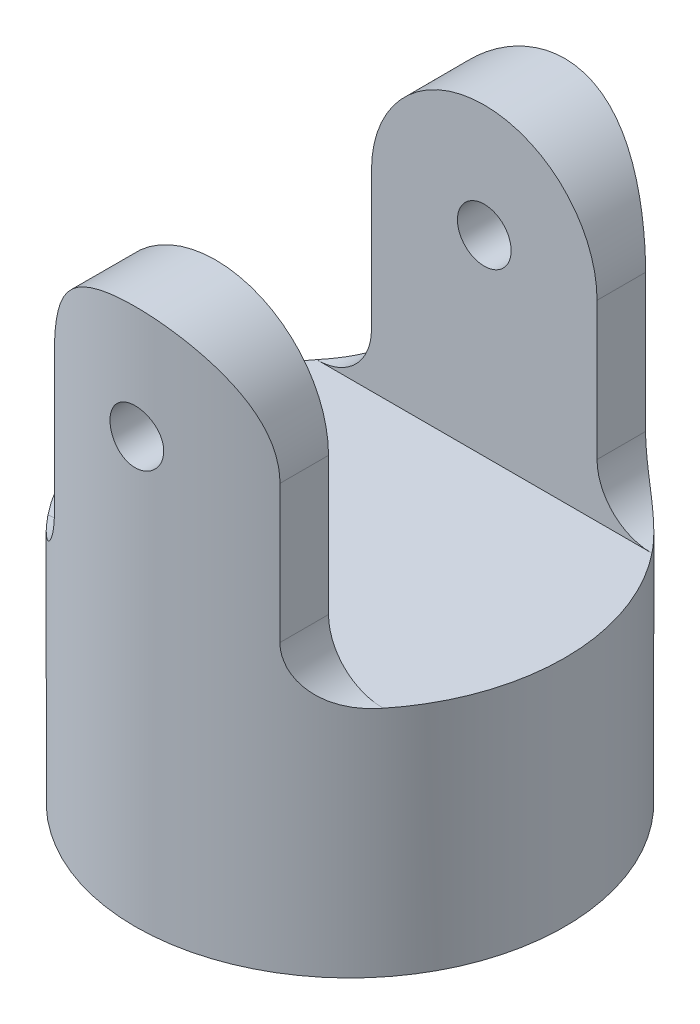
ISO-10303-21;
HEADER;
FILE_DESCRIPTION(('STEP AP214'),'2;1');
FILE_NAME('part.step','',(''),(''),'','','');
FILE_SCHEMA(('AUTOMOTIVE_DESIGN { 1 0 10303 214 1 1 1 1 }'));
ENDSEC;
DATA;
#1=APPLICATION_CONTEXT('core data for automotive mechanical design processes');
#2=APPLICATION_PROTOCOL_DEFINITION('international standard','automotive_design',2000,#1);
#3=PRODUCT_CONTEXT('',#1,'mechanical');
#4=PRODUCT('Part','Part','',(#3));
#5=PRODUCT_RELATED_PRODUCT_CATEGORY('part','',(#4));
#6=PRODUCT_DEFINITION_FORMATION('','',#4);
#7=PRODUCT_DEFINITION_CONTEXT('part definition',#1,'design');
#8=PRODUCT_DEFINITION('design','',#6,#7);
#9=PRODUCT_DEFINITION_SHAPE('','',#8);
#10=(LENGTH_UNIT() NAMED_UNIT(*) SI_UNIT(.MILLI.,.METRE.));
#11=(NAMED_UNIT(*) PLANE_ANGLE_UNIT() SI_UNIT($,.RADIAN.));
#12=(NAMED_UNIT(*) SI_UNIT($,.STERADIAN.) SOLID_ANGLE_UNIT());
#13=UNCERTAINTY_MEASURE_WITH_UNIT(LENGTH_MEASURE(1.E-05),#10,'distance_accuracy_value','');
#14=(GEOMETRIC_REPRESENTATION_CONTEXT(3) GLOBAL_UNCERTAINTY_ASSIGNED_CONTEXT((#13)) GLOBAL_UNIT_ASSIGNED_CONTEXT((#10,
#11,#12)) REPRESENTATION_CONTEXT('',''));
#15=CARTESIAN_POINT('',(0.,0.,0.));
#16=DIRECTION('',(0.,0.,1.));
#17=DIRECTION('',(1.,0.,0.));
#18=AXIS2_PLACEMENT_3D('',#15,#16,#17);
#19=CARTESIAN_POINT('',(0.,15.,0.));
#20=DIRECTION('',(0.,-1.,0.));
#21=DIRECTION('',(0.,0.,-1.));
#22=AXIS2_PLACEMENT_3D('',#19,#20,#21);
#23=CYLINDRICAL_SURFACE('',#22,6.);
#24=CARTESIAN_POINT('',(0.,12.6,-6.));
#25=CARTESIAN_POINT('',(-0.0419523286667284,12.5999982177193,-5.99999941468929));
#26=CARTESIAN_POINT('',(-0.083930872290824,12.5964681362492,-5.99955535366471));
#27=CARTESIAN_POINT('',(-0.166719840626926,12.5824416736288,-5.99782662033408));
#28=CARTESIAN_POINT('',(-0.207528999187123,12.571938018623,-5.99654107032429));
#29=CARTESIAN_POINT('',(-0.286768672443916,12.5442787068258,-5.99327418313322));
#30=CARTESIAN_POINT('',(-0.325200768043841,12.527127527457,-5.99129331436663));
#31=CARTESIAN_POINT('',(-0.398633842467911,12.4866698148091,-5.98685610263429));
#32=CARTESIAN_POINT('',(-0.433635408466911,12.4633643374408,-5.98439984125235));
#33=CARTESIAN_POINT('',(-0.499413845079395,12.4111224150481,-5.97927096391898));
#34=CARTESIAN_POINT('',(-0.530169109481138,12.3821588611961,-5.97659734407725));
#35=CARTESIAN_POINT('',(-0.586395838067248,12.319481152939,-5.97134317802925));
#36=CARTESIAN_POINT('',(-0.611867032917675,12.285766756526,-5.96876263657281));
#37=CARTESIAN_POINT('',(-0.656883048385182,12.2144040067303,-5.96397691685876));
#38=CARTESIAN_POINT('',(-0.676407628782322,12.1767427915296,-5.96177303153373));
#39=CARTESIAN_POINT('',(-0.708846922972535,12.0986438844158,-5.95800338537305));
#40=CARTESIAN_POINT('',(-0.721761887419565,12.0582062978559,-5.95643760033941));
#41=CARTESIAN_POINT('',(-0.740549694007429,11.975926741324,-5.95413101881084));
#42=CARTESIAN_POINT('',(-0.746459014419511,11.9340932226887,-5.95338595031023));
#43=CARTESIAN_POINT('',(-0.751180664867169,11.8500221209584,-5.95279208442838));
#44=CARTESIAN_POINT('',(-0.749993280300725,11.8077845541806,-5.95294325100452));
#45=CARTESIAN_POINT('',(-0.740585170934371,11.7243585518254,-5.95412086610926));
#46=CARTESIAN_POINT('',(-0.732404628895409,11.6831655041399,-5.95514231388099));
#47=CARTESIAN_POINT('',(-0.709305114954616,11.6027414936343,-5.95793759927289));
#48=CARTESIAN_POINT('',(-0.694386006525571,11.5635105705858,-5.95971145213717));
#49=CARTESIAN_POINT('',(-0.658189667973496,11.4879996002935,-5.96381734759395));
#50=CARTESIAN_POINT('',(-0.636894976112292,11.4517280099253,-5.96615091963433));
#51=CARTESIAN_POINT('',(-0.588564440837076,11.383257991676,-5.97111213429179));
#52=CARTESIAN_POINT('',(-0.561528334824234,11.3510597502079,-5.97373979035699));
#53=CARTESIAN_POINT('',(-0.502259733226134,11.2914171867832,-5.97901532967128));
#54=CARTESIAN_POINT('',(-0.469992602352004,11.2640072724702,-5.98166322716067));
#55=CARTESIAN_POINT('',(-0.401297150734177,11.2149873359908,-5.98666389766756));
#56=CARTESIAN_POINT('',(-0.364868820395475,11.1933773271984,-5.98901667000452));
#57=CARTESIAN_POINT('',(-0.288858501409044,11.1565706038608,-5.99316345665574));
#58=CARTESIAN_POINT('',(-0.249275458601315,11.1413760438356,-5.99495728320461));
#59=CARTESIAN_POINT('',(-0.168092382129317,11.117858851943,-5.99778235734018));
#60=CARTESIAN_POINT('',(-0.1264924429892,11.1095358983589,-5.99881364062761));
#61=CARTESIAN_POINT('',(-0.0427539491740493,11.1000427727218,-5.99999278923228));
#62=CARTESIAN_POINT('',(-0.000620847059582189,11.0988252022908,-6.00014650842791));
#63=CARTESIAN_POINT('',(0.083248810949249,11.1034523202168,-5.99956901401629));
#64=CARTESIAN_POINT('',(0.124985375269412,11.1092968581755,-5.99883781925464));
#65=CARTESIAN_POINT('',(0.206737352316457,11.1278429126323,-5.99657630627008));
#66=CARTESIAN_POINT('',(0.246757971127412,11.1405218290208,-5.99504862244161));
#67=CARTESIAN_POINT('',(0.324104896457522,11.1723532355739,-5.99136516930059));
#68=CARTESIAN_POINT('',(0.361431111439595,11.1915059455474,-5.98920937866187));
#69=CARTESIAN_POINT('',(0.432541356206229,11.2358559412522,-5.98449546873034));
#70=CARTESIAN_POINT('',(0.466306127983146,11.2610838869417,-5.98193533212753));
#71=CARTESIAN_POINT('',(0.529139096887896,11.3168248492603,-5.97670542697697));
#72=CARTESIAN_POINT('',(0.558207107501058,11.3473380756753,-5.9740356540807));
#73=CARTESIAN_POINT('',(0.610989587645405,11.4129922250271,-5.96886931638775));
#74=CARTESIAN_POINT('',(0.63467263817038,11.4481585038931,-5.96637382416398));
#75=CARTESIAN_POINT('',(0.675795866833052,11.5219974734564,-5.96185623311145));
#76=CARTESIAN_POINT('',(0.693236170118511,11.560670093843,-5.95983412479308));
#77=CARTESIAN_POINT('',(0.721327973659963,11.6403225957443,-5.95649955117899));
#78=CARTESIAN_POINT('',(0.731997188237133,11.6812961490144,-5.95518523555437));
#79=CARTESIAN_POINT('',(0.746300998160354,11.7644707451342,-5.95340974772236));
#80=CARTESIAN_POINT('',(0.749935920760729,11.8066717307877,-5.95294853582633));
#81=CARTESIAN_POINT('',(0.750061960825451,11.8907906787614,-5.95293263094737));
#82=CARTESIAN_POINT('',(0.746602439309782,11.9327085744996,-5.95337167425586));
#83=CARTESIAN_POINT('',(0.732742321454798,12.0153621388035,-5.9550933436116));
#84=CARTESIAN_POINT('',(0.722341724371731,12.0560978072426,-5.95637596974924));
#85=CARTESIAN_POINT('',(0.694910122106897,12.1352240870299,-5.95963834732365));
#86=CARTESIAN_POINT('',(0.67788149429128,12.1736155335065,-5.96161784877835));
#87=CARTESIAN_POINT('',(0.637682070645093,12.2470039962145,-5.96605134973446));
#88=CARTESIAN_POINT('',(0.614511197852877,12.2820009699059,-5.96850535518124));
#89=CARTESIAN_POINT('',(0.562501899379751,12.3478593676021,-5.9736318142567));
#90=CARTESIAN_POINT('',(0.533626687732487,12.3786916382865,-5.9763056162521));
#91=CARTESIAN_POINT('',(0.471105068090514,12.4350920475504,-5.9815584947787));
#92=CARTESIAN_POINT('',(0.437457536742469,12.4606589432323,-5.98413754882677));
#93=CARTESIAN_POINT('',(0.366199686256262,12.5058856071316,-5.98892116976024));
#94=CARTESIAN_POINT('',(0.32857478387885,12.5255225417698,-5.9911242752349));
#95=CARTESIAN_POINT('',(0.250554870690384,12.5581713728749,-5.99489294723018));
#96=CARTESIAN_POINT('',(0.210162924261071,12.571190467906,-5.99645920610873));
#97=CARTESIAN_POINT('',(0.141301731590377,12.5871178014514,-5.99840016098324));
#98=CARTESIAN_POINT('',(0.113266699055076,12.5919416825946,-5.99899717768636));
#99=CARTESIAN_POINT('',(0.0568251189637304,12.598383373708,-5.99979729398757));
#100=CARTESIAN_POINT('',(0.0284185741488081,12.6000012073198,-6.00000039649041));
#101=CARTESIAN_POINT('',(0.,12.6,-6.));
#102=B_SPLINE_CURVE_WITH_KNOTS('',3,(#24,#25,#26,#27,#28,#29,#30,#31,#32,#33,#34,#35,#36,#37,
#38,#39,#40,#41,#42,#43,#44,#45,#46,#47,#48,#49,#50,#51,#52,#53,#54,#55,#56,#57,#58,#59,#60,#61,
#62,#63,#64,#65,#66,#67,#68,#69,#70,#71,#72,#73,#74,#75,#76,#77,#78,#79,#80,#81,#82,#83,#84,#85,
#86,#87,#88,#89,#90,#91,#92,#93,#94,#95,#96,#97,#98,#99,#100,#101),.UNSPECIFIED.,.T.,.F.,(4,2,2,
2,2,2,2,2,2,2,2,2,2,2,2,2,2,2,2,2,2,2,2,2,2,2,2,2,2,2,2,2,2,2,2,2,2,2,4),(0.,0.125753181832874,
0.251637738283028,0.377437652454531,0.503215996773219,0.62961243960553,0.756015323400032,
0.882843750956608,1.00966736849042,1.13582767585896,1.26198290965399,1.38741808932508,
1.51285581049872,1.6386402788566,1.76443050154092,1.89109043440925,2.01775065933934,
2.14445338719482,2.27115018271134,2.39700083817576,2.52284881350579,2.64828316168019,
2.77372176923684,2.89980720878527,3.02589765412527,3.15270591452272,3.27951163266462,
3.40598422284278,3.53245092903187,3.65804070360665,3.78363049163865,3.90917527411946,
4.03472162973679,4.16110571307549,4.28751959541004,4.41441420911056,4.5411704960521,
4.62635652956289,4.71154193490131),.UNSPECIFIED.);
#103=CARTESIAN_POINT('',(0.,12.6,-6.));
#104=VERTEX_POINT('',#103);
#105=EDGE_CURVE('E408',#104,#104,#102,.T.);
#106=ORIENTED_EDGE('',*,*,#105,.T.);
#107=EDGE_LOOP('',(#106));
#108=FACE_BOUND('',#107,.T.);
#109=CARTESIAN_POINT('',(0.75,11.85,5.95294044989533));
#110=CARTESIAN_POINT('',(0.749998216450185,11.8080491148625,5.95294105251399));
#111=CARTESIAN_POINT('',(0.746468369706386,11.7660720105286,5.95338868535683));
#112=CARTESIAN_POINT('',(0.732442924116402,11.6832860323786,5.95513017293991));
#113=CARTESIAN_POINT('',(0.721940046327388,11.6424784258509,5.95642491192888));
#114=CARTESIAN_POINT('',(0.694283007847788,11.5632420353652,5.95971172132628));
#115=CARTESIAN_POINT('',(0.677133361439472,11.5248116573644,5.96170331836095));
#116=CARTESIAN_POINT('',(0.636679259528859,11.4513814644531,5.96615887055972));
#117=CARTESIAN_POINT('',(0.613375856212438,11.4163810644771,5.96862274495285));
#118=CARTESIAN_POINT('',(0.561136035079326,11.3506013258634,5.9737606777317));
#119=CARTESIAN_POINT('',(0.53217204450729,11.3198439593043,5.97643572510613));
#120=CARTESIAN_POINT('',(0.469492578201369,11.2636131693183,5.9816856986275));
#121=CARTESIAN_POINT('',(0.435776866217411,11.2381400087716,5.98426061978815));
#122=CARTESIAN_POINT('',(0.364412949202793,11.1931219261481,5.98903033383847));
#123=CARTESIAN_POINT('',(0.326752108668336,11.1735968864701,5.99122384154042));
#124=CARTESIAN_POINT('',(0.248654015416777,11.1411566400177,5.99497271086358));
#125=CARTESIAN_POINT('',(0.208216865808273,11.128241187922,5.9965280961689));
#126=CARTESIAN_POINT('',(0.125938706325335,11.1094523794997,5.99881850611869));
#127=CARTESIAN_POINT('',(0.0841061578990149,11.1035424964428,5.99955778450782));
#128=CARTESIAN_POINT('',(3.69602059650231E-05,11.098819384489,6.00014720918765));
#129=CARTESIAN_POINT('',(-0.0421996730984305,11.1000058764142,5.99999739045624));
#130=CARTESIAN_POINT('',(-0.125629580692364,11.1094125608272,5.99882894331003));
#131=CARTESIAN_POINT('',(-0.166827361729335,11.1175934695444,5.99781516736718));
#132=CARTESIAN_POINT('',(-0.247260649171612,11.140695352989,5.995038167827));
#133=CARTESIAN_POINT('',(-0.286496118256861,11.15561645585,5.99327492998214));
#134=CARTESIAN_POINT('',(-0.362012644631592,11.1918169478351,5.98918877342374));
#135=CARTESIAN_POINT('',(-0.398285468352155,11.2131133373191,5.98686436152972));
#136=CARTESIAN_POINT('',(-0.466757235691943,11.2614475086648,5.98191590719585));
#137=CARTESIAN_POINT('',(-0.498955992365207,11.2884855538406,5.97929185101679));
#138=CARTESIAN_POINT('',(-0.558596409231883,11.3477555455795,5.97401660257054));
#139=CARTESIAN_POINT('',(-0.586004051998799,11.380021727864,5.97136534741418));
#140=CARTESIAN_POINT('',(-0.635019855187532,11.4487144670347,5.96635221582174));
#141=CARTESIAN_POINT('',(-0.656627997430529,11.4851410369614,5.96399034029274));
#142=CARTESIAN_POINT('',(-0.693433372074821,11.5611508486687,5.95982340783815));
#143=CARTESIAN_POINT('',(-0.708627878958699,11.600735423986,5.95801858772439));
#144=CARTESIAN_POINT('',(-0.732144496340427,11.6819218360581,5.95517472748787));
#145=CARTESIAN_POINT('',(-0.740466938039886,11.7235235754926,5.95413565046011));
#146=CARTESIAN_POINT('',(-0.749958129572583,11.8072629545999,5.95294766635215));
#147=CARTESIAN_POINT('',(-0.751174752599486,11.8493950869266,5.95279280232713));
#148=CARTESIAN_POINT('',(-0.746546085969168,11.9332625788996,5.95337502335895));
#149=CARTESIAN_POINT('',(-0.740700946832943,11.9749979469838,5.95411208940435));
#150=CARTESIAN_POINT('',(-0.722154985739319,12.0567437290734,5.95638968545196));
#151=CARTESIAN_POINT('',(-0.709477345123819,12.0967594845571,5.95792749808398));
#152=CARTESIAN_POINT('',(-0.677650115734839,12.1740972464559,5.96163110991242));
#153=CARTESIAN_POINT('',(-0.658500299574368,12.2114191581723,5.96379693117229));
#154=CARTESIAN_POINT('',(-0.614154606646477,12.2825263931439,5.9685267940597));
#155=CARTESIAN_POINT('',(-0.588927335873133,12.3162919995943,5.97109287821125));
#156=CARTESIAN_POINT('',(-0.533187222710688,12.3791269661805,5.97632771865307));
#157=CARTESIAN_POINT('',(-0.502674174727646,12.4081961435604,5.97899647893387));
#158=CARTESIAN_POINT('',(-0.437019532667557,12.4609812562003,5.98415426606088));
#159=CARTESIAN_POINT('',(-0.40185254763511,12.4846657340385,5.98664218173756));
#160=CARTESIAN_POINT('',(-0.328011774504537,12.5257914652901,5.99114133909483));
#161=CARTESIAN_POINT('',(-0.289338057110497,12.5432328445443,5.99315259038315));
#162=CARTESIAN_POINT('',(-0.209686157741837,12.5713253360724,5.99646687195956));
#163=CARTESIAN_POINT('',(-0.168714469953534,12.5819946288095,5.99777179706312));
#164=CARTESIAN_POINT('',(-0.0855438171833886,12.596299226768,5.99953426403269));
#165=CARTESIAN_POINT('',(-0.0433449076314328,12.5999348491798,5.99999184411053));
#166=CARTESIAN_POINT('',(0.0407751550031346,12.6000629766876,6.000007884041));
#167=CARTESIAN_POINT('',(0.0826962413144199,12.5966039881704,5.99957244950352));
#168=CARTESIAN_POINT('',(0.165356322435784,12.5827438159707,5.99786352347382));
#169=CARTESIAN_POINT('',(0.206095318067954,12.5723426371165,5.99659003256444));
#170=CARTESIAN_POINT('',(0.285228432896195,12.5449085656951,5.9933474556361));
#171=CARTESIAN_POINT('',(0.323623368047872,12.527877996188,5.99137861330341));
#172=CARTESIAN_POINT('',(0.397018001143208,12.4876736056177,5.98696334281884));
#173=CARTESIAN_POINT('',(0.432017658716409,12.4644997115215,5.98451690898936));
#174=CARTESIAN_POINT('',(0.497876030388767,12.4124870353991,5.97939958177674));
#175=CARTESIAN_POINT('',(0.52870613635029,12.3836121619429,5.97672732383676));
#176=CARTESIAN_POINT('',(0.585102335645804,12.3210921167913,5.97147047704062));
#177=CARTESIAN_POINT('',(0.610667180338047,12.2874458167527,5.96888590910099));
#178=CARTESIAN_POINT('',(0.655891572754811,12.2161890231908,5.96408643418406));
#179=CARTESIAN_POINT('',(0.675527934950021,12.1785637230195,5.96187299325685));
#180=CARTESIAN_POINT('',(0.708175586503006,12.1005429778216,5.95808357435887));
#181=CARTESIAN_POINT('',(0.721194081368494,12.060150600209,5.95650690346163));
#182=CARTESIAN_POINT('',(0.737119768871394,11.9912910038869,5.95455236045953));
#183=CARTESIAN_POINT('',(0.741942909303174,11.9632581145387,5.95395090456573));
#184=CARTESIAN_POINT('',(0.748383616771653,11.9068208250099,5.95314474668974));
#185=CARTESIAN_POINT('',(0.750001208129796,11.8784164276497,5.95294004169728));
#186=CARTESIAN_POINT('',(0.75,11.85,5.95294044989533));
#187=B_SPLINE_CURVE_WITH_KNOTS('',3,(#109,#110,#111,#112,#113,#114,#115,#116,#117,#118,#119,
#120,#121,#122,#123,#124,#125,#126,#127,#128,#129,#130,#131,#132,#133,#134,#135,#136,#137,#138,
#139,#140,#141,#142,#143,#144,#145,#146,#147,#148,#149,#150,#151,#152,#153,#154,#155,#156,#157,
#158,#159,#160,#161,#162,#163,#164,#165,#166,#167,#168,#169,#170,#171,#172,#173,#174,#175,#176,
#177,#178,#179,#180,#181,#182,#183,#184,#185,#186),.UNSPECIFIED.,.T.,.F.,(4,2,2,2,2,2,2,2,2,2,2,
2,2,2,2,2,2,2,2,2,2,2,2,2,2,2,2,2,2,2,2,2,2,2,2,2,2,2,4),(0.,0.125748845243773,
0.251629162845714,0.377424135774361,0.503197613851839,0.629599732647197,0.756008138227736,
0.882834558437221,1.00965627101949,1.13581379082437,1.26196634751033,1.38741499479912,
1.51286602701537,1.63865461323841,1.76444896940732,1.89110309213331,2.01775761185828,
2.14446590021703,2.27116808146857,2.39701565341765,2.52286054298135,2.6482811288782,
2.77370612163556,2.89979345863233,3.02588570098443,3.15269665767703,3.27950505812663,
3.40597157035482,3.53243237931844,3.65803144886477,3.78363043106037,3.90918544063227,
4.03474194289275,4.16112038667251,4.28752876631949,4.4144252931145,4.54118335794605,
4.62636296889885,4.71154193356642),.UNSPECIFIED.);
#188=CARTESIAN_POINT('',(0.75,11.85,5.95294044989533));
#189=VERTEX_POINT('',#188);
#190=EDGE_CURVE('E412',#189,#189,#187,.T.);
#191=ORIENTED_EDGE('',*,*,#190,.T.);
#192=EDGE_LOOP('',(#191));
#193=FACE_BOUND('',#192,.T.);
#194=CARTESIAN_POINT('',(0.,0.,0.));
#195=DIRECTION('',(0.,1.,0.));
#196=DIRECTION('',(0.,0.,1.));
#197=AXIS2_PLACEMENT_3D('',#194,#195,#196);
#198=CIRCLE('',#197,6.);
#199=CARTESIAN_POINT('',(0.,0.,6.));
#200=VERTEX_POINT('',#199);
#201=EDGE_CURVE('E294',#200,#200,#198,.T.);
#202=ORIENTED_EDGE('',*,*,#201,.T.);
#203=EDGE_LOOP('',(#202));
#204=FACE_BOUND('',#203,.T.);
#205=DIRECTION('',(0.,-1.,0.));
#206=VECTOR('',#205,1.);
#207=CARTESIAN_POINT('',(3.15,15.,5.10661335916476));
#208=LINE('',#207,#206);
#209=CARTESIAN_POINT('',(3.15,8.,5.10661335916476));
#210=VERTEX_POINT('',#209);
#211=CARTESIAN_POINT('',(3.15,11.85,5.10661335916476));
#212=VERTEX_POINT('',#211);
#213=EDGE_CURVE('E477',#210,#212,#208,.F.);
#214=ORIENTED_EDGE('',*,*,#213,.T.);
#215=CARTESIAN_POINT('',(-3.15,11.85,5.10661335916476));
#216=CARTESIAN_POINT('',(-3.15001553002084,11.9318443388245,5.10658703577101));
#217=CARTESIAN_POINT('',(-3.14681080311421,12.0136738935938,5.10858027393052));
#218=CARTESIAN_POINT('',(-3.13408333051764,12.1766004389433,5.11640719891282));
#219=CARTESIAN_POINT('',(-3.12456494224072,12.2576978956861,5.12223823703237));
#220=CARTESIAN_POINT('',(-3.09941129771566,12.4180684460604,5.13749469977293));
#221=CARTESIAN_POINT('',(-3.08381469855571,12.497349781216,5.14689739944555));
#222=CARTESIAN_POINT('',(-3.04671961340923,12.6540457720237,5.16894231740933));
#223=CARTESIAN_POINT('',(-3.02522034518325,12.7314601787846,5.18158496505335));
#224=CARTESIAN_POINT('',(-2.95234161540175,12.9597807100791,5.22368063689342));
#225=CARTESIAN_POINT('',(-2.89249523906496,13.1072997580038,5.25735699715152));
#226=CARTESIAN_POINT('',(-2.75227012458837,13.3903107021859,5.33210115263615));
#227=CARTESIAN_POINT('',(-2.67185636557233,13.5257815479197,5.3731815193601));
#228=CARTESIAN_POINT('',(-2.48426131666499,13.7942528188555,5.46261697540076));
#229=CARTESIAN_POINT('',(-2.37531378013408,13.9259148282154,5.51129393549107));
#230=CARTESIAN_POINT('',(-2.13741480448213,14.1701380302645,5.60784635148983));
#231=CARTESIAN_POINT('',(-2.00845558989099,14.2826917627498,5.65572148780744));
#232=CARTESIAN_POINT('',(-1.7221463918038,14.4939979211784,5.74966008199784));
#233=CARTESIAN_POINT('',(-1.56337820302334,14.59103221782,5.79530369790322));
#234=CARTESIAN_POINT('',(-1.22897787540047,14.7563342294409,5.87528959670535));
#235=CARTESIAN_POINT('',(-1.05336794372831,14.8246392029279,5.90964650437023));
#236=CARTESIAN_POINT('',(-0.73140697805043,14.9174093608546,5.95695505939261));
#237=CARTESIAN_POINT('',(-0.587328277345295,14.9482713752362,5.97297940374148));
#238=CARTESIAN_POINT('',(-0.295507664434141,14.9895648452487,5.99450156423869));
#239=CARTESIAN_POINT('',(-0.147767001522723,15.0000031739484,6.00000292161505));
#240=CARTESIAN_POINT('',(0.164759691019966,14.9999964610586,5.99999674240941));
#241=CARTESIAN_POINT('',(0.329552126654997,14.9870118662458,5.9931504704054));
#242=CARTESIAN_POINT('',(0.654088228241191,14.9357248058426,5.96646706979477));
#243=CARTESIAN_POINT('',(0.813829098422247,14.8974085688916,5.94662287501759));
#244=CARTESIAN_POINT('',(1.12326060110906,14.7973961589254,5.89599861004652));
#245=CARTESIAN_POINT('',(1.2729848633699,14.73578337352,5.86525756825403));
#246=CARTESIAN_POINT('',(1.5597499251547,14.5914373996009,5.79560061773275));
#247=CARTESIAN_POINT('',(1.69678816942931,14.5086999686662,5.75668306721018));
#248=CARTESIAN_POINT('',(1.96419830400532,14.3184125562187,5.67123253638535));
#249=CARTESIAN_POINT('',(2.09356966104835,14.2096061180456,5.62437022070838));
#250=CARTESIAN_POINT('',(2.33317673358948,13.9730177198398,5.52928014224933));
#251=CARTESIAN_POINT('',(2.44339321635684,13.845216924315,5.48105106299942));
#252=CARTESIAN_POINT('',(2.6514000556695,13.5606286766576,5.383716595244));
#253=CARTESIAN_POINT('',(2.74722846957303,13.4022770751967,5.33491115270673));
#254=CARTESIAN_POINT('',(2.86954536054654,13.1526162879673,5.26952096643093));
#255=CARTESIAN_POINT('',(2.90673442847148,13.0674160682662,5.24903491647991));
#256=CARTESIAN_POINT('',(2.97362137561426,12.8934279427068,5.21143427093687));
#257=CARTESIAN_POINT('',(3.00332450379462,12.804642601615,5.19431731487129));
#258=CARTESIAN_POINT('',(3.04889636393431,12.6449537327203,5.16766463835895));
#259=CARTESIAN_POINT('',(3.06637577872563,12.5746438888478,5.15729084789584));
#260=CARTESIAN_POINT('',(3.09649309751131,12.4326614371657,5.13926426633043));
#261=CARTESIAN_POINT('',(3.10913225928512,12.3609891884763,5.13161076837501));
#262=CARTESIAN_POINT('',(3.12947653059023,12.2163707312505,5.11923117002799));
#263=CARTESIAN_POINT('',(3.13715965309605,12.1434203007247,5.11451811764942));
#264=CARTESIAN_POINT('',(3.14742824773799,11.996982856906,5.10819947195366));
#265=CARTESIAN_POINT('',(3.15001051379385,11.9234955352593,5.10659583303151));
#266=CARTESIAN_POINT('',(3.15,11.85,5.10661335916476));
#267=B_SPLINE_CURVE_WITH_KNOTS('',3,(#215,#216,#217,#218,#219,#220,#221,#222,#223,#224,#225,
#226,#227,#228,#229,#230,#231,#232,#233,#234,#235,#236,#237,#238,#239,#240,#241,#242,#243,#244,
#245,#246,#247,#248,#249,#250,#251,#252,#253,#254,#255,#256,#257,#258,#259,#260,#261,#262,#263,
#264,#265,#266),.UNSPECIFIED.,.F.,.F.,(4,2,2,2,2,2,2,2,2,2,2,2,2,2,2,2,2,2,2,2,2,2,2,2,2,4),(0.,
0.245421879371357,0.490674555281819,0.734392244722035,0.978142247966399,1.4640269496978,
1.95074455878845,2.48160563988349,3.01267350412188,3.58443029159324,4.15544327510846,
4.59837709701003,5.04116183521385,5.53486527307917,6.02883733012883,6.52105775049214,
7.01337710037425,7.53745994706819,8.06206600425766,8.63308306150028,8.91832743743151,
9.20337124684027,9.42273405125347,9.64203981369968,9.86231193423528,10.0827224600912),.UNSPECIFIED.);
#268=CARTESIAN_POINT('',(-3.15,11.85,5.10661335916476));
#269=VERTEX_POINT('',#268);
#270=EDGE_CURVE('E360',#269,#212,#267,.T.);
#271=ORIENTED_EDGE('',*,*,#270,.F.);
#272=DIRECTION('',(0.,-1.,0.));
#273=VECTOR('',#272,1.);
#274=CARTESIAN_POINT('',(-3.15,15.,5.10661335916476));
#275=LINE('',#274,#273);
#276=CARTESIAN_POINT('',(-3.15,8.,5.10661335916476));
#277=VERTEX_POINT('',#276);
#278=EDGE_CURVE('E458',#277,#269,#275,.F.);
#279=ORIENTED_EDGE('',*,*,#278,.F.);
#280=CARTESIAN_POINT('',(-4.65,6.5,3.79176739792936));
#281=CARTESIAN_POINT('',(-4.61025024886713,6.50000505502142,3.84052264466323));
#282=CARTESIAN_POINT('',(-4.56971135136197,6.50158113093703,3.88866330483559));
#283=CARTESIAN_POINT('',(-4.48721162436453,6.50828282097173,3.98357565065952));
#284=CARTESIAN_POINT('',(-4.44524879389684,6.51341364497822,4.03034522182074));
#285=CARTESIAN_POINT('',(-4.35977336898431,6.52770192556705,4.12266557630679));
#286=CARTESIAN_POINT('',(-4.31624987207917,6.5368969994065,4.16820065272347));
#287=CARTESIAN_POINT('',(-4.22840820918457,6.55975001035175,4.25728558066949));
#288=CARTESIAN_POINT('',(-4.18409051279939,6.57340538738271,4.30083655471097));
#289=CARTESIAN_POINT('',(-4.06769735166873,6.61552812753565,4.41176309167763));
#290=CARTESIAN_POINT('',(-3.99527721937652,6.64794268631255,4.47735841073511));
#291=CARTESIAN_POINT('',(-3.85223243422572,6.72712455569309,4.60100005425677));
#292=CARTESIAN_POINT('',(-3.78160209125706,6.77383787320525,4.65907362691965));
#293=CARTESIAN_POINT('',(-3.65642942793946,6.87387194781857,4.75771312019591));
#294=CARTESIAN_POINT('',(-3.60112436774485,6.92492908563286,4.79959304083452));
#295=CARTESIAN_POINT('',(-3.49671343333686,7.03779782368283,4.87618592266318));
#296=CARTESIAN_POINT('',(-3.44760920237236,7.0996122643766,4.91089698561452));
#297=CARTESIAN_POINT('',(-3.35813583684684,7.23344670252592,4.9725151149369));
#298=CARTESIAN_POINT('',(-3.31782360954412,7.30552846820399,4.9993717025862));
#299=CARTESIAN_POINT('',(-3.24901777577134,7.45760289701596,5.04436237292911));
#300=CARTESIAN_POINT('',(-3.22051198875958,7.5375873010258,5.06250544833329));
#301=CARTESIAN_POINT('',(-3.18282960243452,7.68149030129626,5.08625125431837));
#302=CARTESIAN_POINT('',(-3.17057352429693,7.74428323585802,5.09387485050384));
#303=CARTESIAN_POINT('',(-3.15825960186224,7.83956221806216,5.10151129896761));
#304=CARTESIAN_POINT('',(-3.15516661929031,7.87153155015716,5.10342362956596));
#305=CARTESIAN_POINT('',(-3.15103539018376,7.93566390418063,5.10597479614617));
#306=CARTESIAN_POINT('',(-3.14999783000953,7.96782698721281,5.10661320673266));
#307=CARTESIAN_POINT('',(-3.15,8.,5.10661335916476));
#308=B_SPLINE_CURVE_WITH_KNOTS('',3,(#280,#281,#282,#283,#284,#285,#286,#287,#288,#289,#290,
#291,#292,#293,#294,#295,#296,#297,#298,#299,#300,#301,#302,#303,#304,#305,#306,#307),
.UNSPECIFIED.,.F.,.F.,(4,2,2,2,2,2,2,2,2,2,2,2,2,4),(0.,0.188722079357417,0.37772133911088,
0.568507785334631,0.759184917954158,1.06687347175063,1.37341421343889,1.63075830933157,
1.888170460137,2.14720230410206,2.40596623877582,2.59852144812183,2.69496573904504,
2.79144222986584),.UNSPECIFIED.);
#309=CARTESIAN_POINT('',(-4.65,6.49999999999999,3.79176739792936));
#310=VERTEX_POINT('',#309);
#311=EDGE_CURVE('E368',#310,#277,#308,.T.);
#312=ORIENTED_EDGE('',*,*,#311,.F.);
#313=CARTESIAN_POINT('',(0.,6.5,0.));
#314=DIRECTION('',(0.,-1.,0.));
#315=DIRECTION('',(0.,0.,-1.));
#316=AXIS2_PLACEMENT_3D('',#313,#314,#315);
#317=CIRCLE('',#316,6.);
#318=CARTESIAN_POINT('',(-4.65,6.49999999999999,-3.79176739792936));
#319=VERTEX_POINT('',#318);
#320=EDGE_CURVE('E293',#310,#319,#317,.T.);
#321=ORIENTED_EDGE('',*,*,#320,.T.);
#322=CARTESIAN_POINT('',(-3.15,8.,-5.10661335916476));
#323=CARTESIAN_POINT('',(-3.14999780834655,7.96298303009158,-5.10661222326606));
#324=CARTESIAN_POINT('',(-3.15137138242597,7.92598483646073,-5.10576768356205));
#325=CARTESIAN_POINT('',(-3.1568346345037,7.8522748584558,-5.10239262341066));
#326=CARTESIAN_POINT('',(-3.16092372561908,7.81556301392955,-5.09986246726168));
#327=CARTESIAN_POINT('',(-3.17716676320046,7.7065101717919,-5.08977240302355));
#328=CARTESIAN_POINT('',(-3.19329713473406,7.63493912585255,-5.07971282028358));
#329=CARTESIAN_POINT('',(-3.23531208802413,7.49608734220827,-5.05305498849073));
#330=CARTESIAN_POINT('',(-3.2611939676888,7.42880542204194,-5.03645855070836));
#331=CARTESIAN_POINT('',(-3.3213913394497,7.30010945604738,-4.99696412902207));
#332=CARTESIAN_POINT('',(-3.35571016417759,7.23869774232268,-4.97406365456591));
#333=CARTESIAN_POINT('',(-3.43238997017879,7.12106920674439,-4.92147565860712));
#334=CARTESIAN_POINT('',(-3.47497993079355,7.06509223588733,-4.89158822501376));
#335=CARTESIAN_POINT('',(-3.56546865444763,6.96147739834131,-4.8260289581596));
#336=CARTESIAN_POINT('',(-3.61336892948569,6.91384191672384,-4.79035547609926));
#337=CARTESIAN_POINT('',(-3.71858623219524,6.82190053723287,-4.70924908157703));
#338=CARTESIAN_POINT('',(-3.7763431431514,6.77868270912247,-4.66315852837417));
#339=CARTESIAN_POINT('',(-3.89393071130699,6.70258889959621,-4.56543286188319));
#340=CARTESIAN_POINT('',(-3.95376323797278,6.66972252491345,-4.51379265745535));
#341=CARTESIAN_POINT('',(-4.10733776476408,6.59778581150743,-4.37556241012333));
#342=CARTESIAN_POINT('',(-4.2012763581353,6.56557515749524,-4.28561504427405));
#343=CARTESIAN_POINT('',(-4.38512761539899,6.52053041100723,-4.09732399638263));
#344=CARTESIAN_POINT('',(-4.47503657270456,6.50771381669729,-3.99897281645954));
#345=CARTESIAN_POINT('',(-4.57656709603125,6.50172415355499,-3.88015050461646));
#346=CARTESIAN_POINT('',(-4.59141150698354,6.50107218267973,-3.86257329657688));
#347=CARTESIAN_POINT('',(-4.62086983051796,6.50021051875448,-3.82728187584622));
#348=CARTESIAN_POINT('',(-4.63548418007754,6.49999985124794,-3.80956805188534));
#349=CARTESIAN_POINT('',(-4.65,6.5,-3.79176739792936));
#350=B_SPLINE_CURVE_WITH_KNOTS('',3,(#322,#323,#324,#325,#326,#327,#328,#329,#330,#331,#332,
#333,#334,#335,#336,#337,#338,#339,#340,#341,#342,#343,#344,#345,#346,#347,#348,#349),
.UNSPECIFIED.,.F.,.F.,(4,2,2,2,2,2,2,2,2,2,2,2,2,4),(0.,0.110978956579974,0.221933935970425,
0.442918271044081,0.663841417497078,0.884851970208291,1.11319268618502,1.34159858510416,
1.59745291490793,1.85354399703677,2.25327186631472,2.6533601729077,2.72240802981286,
2.79130325844606),.UNSPECIFIED.);
#351=CARTESIAN_POINT('',(-3.15,8.,-5.10661335916476));
#352=VERTEX_POINT('',#351);
#353=EDGE_CURVE('E374',#352,#319,#350,.T.);
#354=ORIENTED_EDGE('',*,*,#353,.F.);
#355=DIRECTION('',(0.,-1.,0.));
#356=VECTOR('',#355,1.);
#357=CARTESIAN_POINT('',(-3.15,15.,-5.10661335916476));
#358=LINE('',#357,#356);
#359=CARTESIAN_POINT('',(-3.15,11.85,-5.10661335916476));
#360=VERTEX_POINT('',#359);
#361=EDGE_CURVE('E433',#360,#352,#358,.T.);
#362=ORIENTED_EDGE('',*,*,#361,.F.);
#363=CARTESIAN_POINT('',(3.15,11.85,-5.10661335916476));
#364=CARTESIAN_POINT('',(3.15001553002084,11.9318443388245,-5.10658703577101));
#365=CARTESIAN_POINT('',(3.14681080311421,12.0136738935938,-5.10858027393052));
#366=CARTESIAN_POINT('',(3.13408333051764,12.1766004389433,-5.11640719891283));
#367=CARTESIAN_POINT('',(3.12456494224072,12.2576978956861,-5.12223823703237));
#368=CARTESIAN_POINT('',(3.09941129771566,12.4180684460604,-5.13749469977293));
#369=CARTESIAN_POINT('',(3.08381469855571,12.497349781216,-5.14689739944555));
#370=CARTESIAN_POINT('',(3.04671961340923,12.6540457720237,-5.16894231740933));
#371=CARTESIAN_POINT('',(3.02522034518325,12.7314601787846,-5.18158496505335));
#372=CARTESIAN_POINT('',(2.95234161540175,12.9597807100791,-5.22368063689342));
#373=CARTESIAN_POINT('',(2.89249523906496,13.1072997580038,-5.25735699715152));
#374=CARTESIAN_POINT('',(2.75227012458837,13.3903107021859,-5.33210115263615));
#375=CARTESIAN_POINT('',(2.67185636557233,13.5257815479197,-5.37318151936009));
#376=CARTESIAN_POINT('',(2.48426131666499,13.7942528188555,-5.46261697540076));
#377=CARTESIAN_POINT('',(2.37531378013408,13.9259148282154,-5.51129393549107));
#378=CARTESIAN_POINT('',(2.13741480448212,14.1701380302645,-5.60784635148983));
#379=CARTESIAN_POINT('',(2.00845558989099,14.2826917627498,-5.65572148780744));
#380=CARTESIAN_POINT('',(1.7221463918038,14.4939979211784,-5.74966008199784));
#381=CARTESIAN_POINT('',(1.56337820302334,14.59103221782,-5.79530369790322));
#382=CARTESIAN_POINT('',(1.22897787540046,14.7563342294409,-5.87528959670535));
#383=CARTESIAN_POINT('',(1.05336794372831,14.8246392029279,-5.90964650437023));
#384=CARTESIAN_POINT('',(0.731406978050431,14.9174093608546,-5.95695505939261));
#385=CARTESIAN_POINT('',(0.587328277345295,14.9482713752362,-5.97297940374148));
#386=CARTESIAN_POINT('',(0.295507664434141,14.9895648452487,-5.99450156423869));
#387=CARTESIAN_POINT('',(0.147767001522723,15.0000031739484,-6.00000292161505));
#388=CARTESIAN_POINT('',(-0.164759691019965,14.9999964610586,-5.99999674240941));
#389=CARTESIAN_POINT('',(-0.329552126654996,14.9870118662458,-5.9931504704054));
#390=CARTESIAN_POINT('',(-0.654088228241189,14.9357248058426,-5.96646706979477));
#391=CARTESIAN_POINT('',(-0.813829098422246,14.8974085688916,-5.94662287501759));
#392=CARTESIAN_POINT('',(-1.12326060110906,14.7973961589254,-5.89599861004652));
#393=CARTESIAN_POINT('',(-1.2729848633699,14.73578337352,-5.86525756825403));
#394=CARTESIAN_POINT('',(-1.5597499251547,14.5914373996009,-5.79560061773275));
#395=CARTESIAN_POINT('',(-1.69678816942931,14.5086999686662,-5.75668306721018));
#396=CARTESIAN_POINT('',(-1.96419830400532,14.3184125562187,-5.67123253638535));
#397=CARTESIAN_POINT('',(-2.09356966104835,14.2096061180456,-5.62437022070838));
#398=CARTESIAN_POINT('',(-2.33317673358948,13.9730177198398,-5.52928014224933));
#399=CARTESIAN_POINT('',(-2.44339321635684,13.845216924315,-5.48105106299942));
#400=CARTESIAN_POINT('',(-2.6514000556695,13.5606286766576,-5.383716595244));
#401=CARTESIAN_POINT('',(-2.74722846957303,13.4022770751967,-5.33491115270673));
#402=CARTESIAN_POINT('',(-2.86954536054654,13.1526162879673,-5.26952096643093));
#403=CARTESIAN_POINT('',(-2.90673442847147,13.0674160682662,-5.24903491647991));
#404=CARTESIAN_POINT('',(-2.97362137561426,12.8934279427068,-5.21143427093687));
#405=CARTESIAN_POINT('',(-3.00332450379462,12.804642601615,-5.19431731487129));
#406=CARTESIAN_POINT('',(-3.04889636393431,12.6449537327203,-5.16766463835895));
#407=CARTESIAN_POINT('',(-3.06637577872563,12.5746438888478,-5.15729084789584));
#408=CARTESIAN_POINT('',(-3.09649309751131,12.4326614371657,-5.13926426633043));
#409=CARTESIAN_POINT('',(-3.10913225928512,12.3609891884763,-5.13161076837501));
#410=CARTESIAN_POINT('',(-3.12947653059023,12.2163707312505,-5.11923117002799));
#411=CARTESIAN_POINT('',(-3.13715965309605,12.1434203007247,-5.11451811764942));
#412=CARTESIAN_POINT('',(-3.14742824773799,11.996982856906,-5.10819947195366));
#413=CARTESIAN_POINT('',(-3.15001051379385,11.9234955352593,-5.10659583303151));
#414=CARTESIAN_POINT('',(-3.15,11.85,-5.10661335916476));
#415=B_SPLINE_CURVE_WITH_KNOTS('',3,(#363,#364,#365,#366,#367,#368,#369,#370,#371,#372,#373,
#374,#375,#376,#377,#378,#379,#380,#381,#382,#383,#384,#385,#386,#387,#388,#389,#390,#391,#392,
#393,#394,#395,#396,#397,#398,#399,#400,#401,#402,#403,#404,#405,#406,#407,#408,#409,#410,#411,
#412,#413,#414),.UNSPECIFIED.,.F.,.F.,(4,2,2,2,2,2,2,2,2,2,2,2,2,2,2,2,2,2,2,2,2,2,2,2,2,4),(0.,
0.245421879371357,0.49067455528182,0.734392244722035,0.978142247966399,1.4640269496978,
1.95074455878845,2.48160563988349,3.01267350412188,3.58443029159324,4.15544327510846,
4.59837709701002,5.04116183521385,5.53486527307917,6.02883733012883,6.52105775049214,
7.01337710037425,7.53745994706819,8.06206600425766,8.63308306150028,8.91832743743151,
9.20337124684027,9.42273405125346,9.64203981369967,9.86231193423527,10.0827224600912),.UNSPECIFIED.);
#416=CARTESIAN_POINT('',(3.15,11.85,-5.10661335916476));
#417=VERTEX_POINT('',#416);
#418=EDGE_CURVE('E353',#417,#360,#415,.T.);
#419=ORIENTED_EDGE('',*,*,#418,.F.);
#420=DIRECTION('',(0.,-1.,0.));
#421=VECTOR('',#420,1.);
#422=CARTESIAN_POINT('',(3.15,15.,-5.10661335916476));
#423=LINE('',#422,#421);
#424=CARTESIAN_POINT('',(3.15,8.,-5.10661335916476));
#425=VERTEX_POINT('',#424);
#426=EDGE_CURVE('E308',#417,#425,#423,.T.);
#427=ORIENTED_EDGE('',*,*,#426,.T.);
#428=CARTESIAN_POINT('',(3.15,8.,-5.10661335916476));
#429=CARTESIAN_POINT('',(3.14999780834655,7.96298303009158,-5.10661222326606));
#430=CARTESIAN_POINT('',(3.15137138242597,7.92598483646073,-5.10576768356205));
#431=CARTESIAN_POINT('',(3.1568346345037,7.8522748584558,-5.10239262341066));
#432=CARTESIAN_POINT('',(3.16092372561908,7.81556301392955,-5.09986246726168));
#433=CARTESIAN_POINT('',(3.17716676320046,7.7065101717919,-5.08977240302355));
#434=CARTESIAN_POINT('',(3.19329713473406,7.63493912585255,-5.07971282028358));
#435=CARTESIAN_POINT('',(3.23531208802413,7.49608734220827,-5.05305498849073));
#436=CARTESIAN_POINT('',(3.2611939676888,7.42880542204194,-5.03645855070836));
#437=CARTESIAN_POINT('',(3.3213913394497,7.30010945604738,-4.99696412902207));
#438=CARTESIAN_POINT('',(3.35571016417759,7.23869774232268,-4.97406365456591));
#439=CARTESIAN_POINT('',(3.43238997017879,7.12106920674439,-4.92147565860712));
#440=CARTESIAN_POINT('',(3.47497993079355,7.06509223588733,-4.89158822501376));
#441=CARTESIAN_POINT('',(3.56546865444763,6.96147739834131,-4.8260289581596));
#442=CARTESIAN_POINT('',(3.61336892948569,6.91384191672384,-4.79035547609926));
#443=CARTESIAN_POINT('',(3.71858623219524,6.82190053723287,-4.70924908157703));
#444=CARTESIAN_POINT('',(3.7763431431514,6.77868270912247,-4.66315852837417));
#445=CARTESIAN_POINT('',(3.89393071130699,6.70258889959621,-4.56543286188319));
#446=CARTESIAN_POINT('',(3.95376323797278,6.66972252491345,-4.51379265745535));
#447=CARTESIAN_POINT('',(4.10733776476408,6.59778581150743,-4.37556241012333));
#448=CARTESIAN_POINT('',(4.2012763581353,6.56557515749524,-4.28561504427405));
#449=CARTESIAN_POINT('',(4.38512761539899,6.52053041100723,-4.09732399638264));
#450=CARTESIAN_POINT('',(4.47503657270456,6.50771381669729,-3.99897281645954));
#451=CARTESIAN_POINT('',(4.57656709603125,6.50172415355499,-3.88015050461646));
#452=CARTESIAN_POINT('',(4.59141150698354,6.50107218267973,-3.86257329657688));
#453=CARTESIAN_POINT('',(4.62086983051796,6.50021051875448,-3.82728187584622));
#454=CARTESIAN_POINT('',(4.63548418007753,6.49999985124794,-3.80956805188534));
#455=CARTESIAN_POINT('',(4.65,6.5,-3.79176739792937));
#456=B_SPLINE_CURVE_WITH_KNOTS('',3,(#428,#429,#430,#431,#432,#433,#434,#435,#436,#437,#438,
#439,#440,#441,#442,#443,#444,#445,#446,#447,#448,#449,#450,#451,#452,#453,#454,#455),
.UNSPECIFIED.,.F.,.F.,(4,2,2,2,2,2,2,2,2,2,2,2,2,4),(0.,0.110978956579974,0.221933935970425,
0.442918271044081,0.663841417497078,0.884851970208291,1.11319268618502,1.34159858510416,
1.59745291490793,1.85354399703677,2.25327186631472,2.65336017290771,2.72240802981286,
2.79130325844606),.UNSPECIFIED.);
#457=CARTESIAN_POINT('',(4.65,6.5,-3.79176739792936));
#458=VERTEX_POINT('',#457);
#459=EDGE_CURVE('E299',#425,#458,#456,.T.);
#460=ORIENTED_EDGE('',*,*,#459,.T.);
#461=CARTESIAN_POINT('',(4.65,6.5,3.79176739792936));
#462=VERTEX_POINT('',#461);
#463=EDGE_CURVE('E281',#458,#462,#317,.T.);
#464=ORIENTED_EDGE('',*,*,#463,.T.);
#465=CARTESIAN_POINT('',(4.65,6.5,3.79176739792937));
#466=CARTESIAN_POINT('',(4.61025024886713,6.50000505502143,3.84052264466323));
#467=CARTESIAN_POINT('',(4.56971135136197,6.50158113093704,3.88866330483559));
#468=CARTESIAN_POINT('',(4.48721162436453,6.50828282097173,3.98357565065952));
#469=CARTESIAN_POINT('',(4.44524879389684,6.51341364497822,4.03034522182074));
#470=CARTESIAN_POINT('',(4.35977336898431,6.52770192556705,4.12266557630679));
#471=CARTESIAN_POINT('',(4.31624987207917,6.53689699940651,4.16820065272348));
#472=CARTESIAN_POINT('',(4.22840820918457,6.55975001035176,4.25728558066949));
#473=CARTESIAN_POINT('',(4.18409051279939,6.57340538738271,4.30083655471097));
#474=CARTESIAN_POINT('',(4.06769735166872,6.61552812753565,4.41176309167763));
#475=CARTESIAN_POINT('',(3.99527721937651,6.64794268631255,4.47735841073511));
#476=CARTESIAN_POINT('',(3.85223243422571,6.72712455569309,4.60100005425677));
#477=CARTESIAN_POINT('',(3.78160209125706,6.77383787320525,4.65907362691965));
#478=CARTESIAN_POINT('',(3.65642942793946,6.87387194781857,4.75771312019591));
#479=CARTESIAN_POINT('',(3.60112436774485,6.92492908563286,4.79959304083452));
#480=CARTESIAN_POINT('',(3.49671343333686,7.03779782368283,4.87618592266318));
#481=CARTESIAN_POINT('',(3.44760920237236,7.0996122643766,4.91089698561452));
#482=CARTESIAN_POINT('',(3.35813583684684,7.23344670252592,4.9725151149369));
#483=CARTESIAN_POINT('',(3.31782360954412,7.30552846820399,4.9993717025862));
#484=CARTESIAN_POINT('',(3.24901777577134,7.45760289701596,5.04436237292911));
#485=CARTESIAN_POINT('',(3.22051198875958,7.5375873010258,5.06250544833329));
#486=CARTESIAN_POINT('',(3.18282960243452,7.68149030129626,5.08625125431837));
#487=CARTESIAN_POINT('',(3.17057352429693,7.74428323585802,5.09387485050384));
#488=CARTESIAN_POINT('',(3.15825960186224,7.83956221806216,5.10151129896761));
#489=CARTESIAN_POINT('',(3.15516661929031,7.87153155015716,5.10342362956596));
#490=CARTESIAN_POINT('',(3.15103539018376,7.93566390418063,5.10597479614617));
#491=CARTESIAN_POINT('',(3.14999783000953,7.96782698721281,5.10661320673266));
#492=CARTESIAN_POINT('',(3.15,7.99999999999999,5.10661335916476));
#493=B_SPLINE_CURVE_WITH_KNOTS('',3,(#465,#466,#467,#468,#469,#470,#471,#472,#473,#474,#475,
#476,#477,#478,#479,#480,#481,#482,#483,#484,#485,#486,#487,#488,#489,#490,#491,#492),
.UNSPECIFIED.,.F.,.F.,(4,2,2,2,2,2,2,2,2,2,2,2,2,4),(0.,0.188722079357417,0.377721339110879,
0.568507785334631,0.759184917954158,1.06687347175063,1.37341421343889,1.63075830933157,
1.88817046013699,2.14720230410206,2.40596623877581,2.59852144812183,2.69496573904504,
2.79144222986584),.UNSPECIFIED.);
#494=EDGE_CURVE('E309',#462,#210,#493,.T.);
#495=ORIENTED_EDGE('',*,*,#494,.T.);
#496=EDGE_LOOP('',(#214,#271,#279,#312,#321,#354,#362,#419,#427,#460,#464,#495));
#497=FACE_BOUND('',#496,.T.);
#498=ADVANCED_FACE('F192',(#108,#193,#204,#497),#23,.T.);
#499=CARTESIAN_POINT('',(-6.,15.,3.75));
#500=DIRECTION('',(0.,0.,1.));
#501=DIRECTION('',(1.,0.,0.));
#502=AXIS2_PLACEMENT_3D('',#499,#500,#501);
#503=PLANE('',#502);
#504=CARTESIAN_POINT('',(0.,11.85,3.75));
#505=DIRECTION('',(0.,0.,1.));
#506=DIRECTION('',(1.,0.,0.));
#507=AXIS2_PLACEMENT_3D('',#504,#505,#506);
#508=CIRCLE('',#507,0.75);
#509=CARTESIAN_POINT('',(0.75,11.85,3.75));
#510=VERTEX_POINT('',#509);
#511=EDGE_CURVE('E485',#510,#510,#508,.T.);
#512=ORIENTED_EDGE('',*,*,#511,.T.);
#513=EDGE_LOOP('',(#512));
#514=FACE_BOUND('',#513,.T.);
#515=CARTESIAN_POINT('',(0.,11.85,3.75));
#516=DIRECTION('',(0.,0.,1.));
#517=DIRECTION('',(1.,0.,0.));
#518=AXIS2_PLACEMENT_3D('',#515,#516,#517);
#519=CIRCLE('',#518,3.15);
#520=CARTESIAN_POINT('',(3.15,11.85,3.75));
#521=VERTEX_POINT('',#520);
#522=CARTESIAN_POINT('',(-3.15,11.85,3.75));
#523=VERTEX_POINT('',#522);
#524=EDGE_CURVE('E460',#521,#523,#519,.T.);
#525=ORIENTED_EDGE('',*,*,#524,.F.);
#526=DIRECTION('',(0.,-1.,0.));
#527=VECTOR('',#526,1.);
#528=CARTESIAN_POINT('',(3.15,15.,3.75));
#529=LINE('',#528,#527);
#530=CARTESIAN_POINT('',(3.15,8.,3.75));
#531=VERTEX_POINT('',#530);
#532=EDGE_CURVE('E312',#521,#531,#529,.T.);
#533=ORIENTED_EDGE('',*,*,#532,.T.);
#534=CARTESIAN_POINT('',(4.65,8.,3.75));
#535=DIRECTION('',(0.,0.,1.));
#536=DIRECTION('',(1.,0.,0.));
#537=AXIS2_PLACEMENT_3D('',#534,#535,#536);
#538=CIRCLE('',#537,1.5);
#539=CARTESIAN_POINT('',(4.65,6.5,3.74999999999999));
#540=VERTEX_POINT('',#539);
#541=EDGE_CURVE('E310',#531,#540,#538,.T.);
#542=ORIENTED_EDGE('',*,*,#541,.T.);
#543=DIRECTION('',(1.,0.,0.));
#544=VECTOR('',#543,1.);
#545=CARTESIAN_POINT('',(-6.,6.5,3.75));
#546=LINE('',#545,#544);
#547=CARTESIAN_POINT('',(-4.65,6.5,3.75));
#548=VERTEX_POINT('',#547);
#549=EDGE_CURVE('E414',#548,#540,#546,.T.);
#550=ORIENTED_EDGE('',*,*,#549,.F.);
#551=CARTESIAN_POINT('',(-4.65,8.,3.75));
#552=DIRECTION('',(0.,0.,1.));
#553=DIRECTION('',(1.,0.,0.));
#554=AXIS2_PLACEMENT_3D('',#551,#552,#553);
#555=CIRCLE('',#554,1.5);
#556=CARTESIAN_POINT('',(-3.15,8.,3.75));
#557=VERTEX_POINT('',#556);
#558=EDGE_CURVE('E366',#557,#548,#555,.F.);
#559=ORIENTED_EDGE('',*,*,#558,.F.);
#560=DIRECTION('',(0.,-1.,0.));
#561=VECTOR('',#560,1.);
#562=CARTESIAN_POINT('',(-3.15,15.,3.75));
#563=LINE('',#562,#561);
#564=EDGE_CURVE('E446',#523,#557,#563,.T.);
#565=ORIENTED_EDGE('',*,*,#564,.F.);
#566=EDGE_LOOP('',(#525,#533,#542,#550,#559,#565));
#567=FACE_BOUND('',#566,.T.);
#568=ADVANCED_FACE('F385',(#514,#567),#503,.F.);
#569=CARTESIAN_POINT('',(-6.,15.,-3.75));
#570=DIRECTION('',(0.,0.,1.));
#571=DIRECTION('',(1.,0.,0.));
#572=AXIS2_PLACEMENT_3D('',#569,#570,#571);
#573=PLANE('',#572);
#574=CARTESIAN_POINT('',(0.,11.85,-3.75));
#575=DIRECTION('',(0.,0.,1.));
#576=DIRECTION('',(1.,0.,0.));
#577=AXIS2_PLACEMENT_3D('',#574,#575,#576);
#578=CIRCLE('',#577,0.75);
#579=CARTESIAN_POINT('',(0.75,11.85,-3.75));
#580=VERTEX_POINT('',#579);
#581=EDGE_CURVE('E196',#580,#580,#578,.T.);
#582=ORIENTED_EDGE('',*,*,#581,.F.);
#583=EDGE_LOOP('',(#582));
#584=FACE_BOUND('',#583,.T.);
#585=DIRECTION('',(0.,-1.,0.));
#586=VECTOR('',#585,1.);
#587=CARTESIAN_POINT('',(3.15,15.,-3.75));
#588=LINE('',#587,#586);
#589=CARTESIAN_POINT('',(3.15,11.85,-3.75));
#590=VERTEX_POINT('',#589);
#591=CARTESIAN_POINT('',(3.15,8.,-3.75));
#592=VERTEX_POINT('',#591);
#593=EDGE_CURVE('E12',#590,#592,#588,.T.);
#594=ORIENTED_EDGE('',*,*,#593,.F.);
#595=CARTESIAN_POINT('',(0.,11.85,-3.75));
#596=DIRECTION('',(0.,0.,1.));
#597=DIRECTION('',(1.,0.,0.));
#598=AXIS2_PLACEMENT_3D('',#595,#596,#597);
#599=CIRCLE('',#598,3.15);
#600=CARTESIAN_POINT('',(-3.15,11.85,-3.75));
#601=VERTEX_POINT('',#600);
#602=EDGE_CURVE('E422',#590,#601,#599,.T.);
#603=ORIENTED_EDGE('',*,*,#602,.T.);
#604=DIRECTION('',(0.,-1.,0.));
#605=VECTOR('',#604,1.);
#606=CARTESIAN_POINT('',(-3.15,15.,-3.75));
#607=LINE('',#606,#605);
#608=CARTESIAN_POINT('',(-3.15,8.,-3.75));
#609=VERTEX_POINT('',#608);
#610=EDGE_CURVE('E419',#601,#609,#607,.T.);
#611=ORIENTED_EDGE('',*,*,#610,.T.);
#612=CARTESIAN_POINT('',(-4.65,8.,-3.75));
#613=DIRECTION('',(0.,0.,1.));
#614=DIRECTION('',(1.,0.,0.));
#615=AXIS2_PLACEMENT_3D('',#612,#613,#614);
#616=CIRCLE('',#615,1.5);
#617=CARTESIAN_POINT('',(-4.65,6.5,-3.75));
#618=VERTEX_POINT('',#617);
#619=EDGE_CURVE('E201',#609,#618,#616,.F.);
#620=ORIENTED_EDGE('',*,*,#619,.T.);
#621=DIRECTION('',(1.,0.,0.));
#622=VECTOR('',#621,1.);
#623=CARTESIAN_POINT('',(-6.,6.5,-3.75));
#624=LINE('',#623,#622);
#625=CARTESIAN_POINT('',(4.65,6.5,-3.75));
#626=VERTEX_POINT('',#625);
#627=EDGE_CURVE('E416',#618,#626,#624,.T.);
#628=ORIENTED_EDGE('',*,*,#627,.T.);
#629=CARTESIAN_POINT('',(4.65,8.,-3.75));
#630=DIRECTION('',(0.,0.,1.));
#631=DIRECTION('',(1.,0.,0.));
#632=AXIS2_PLACEMENT_3D('',#629,#630,#631);
#633=CIRCLE('',#632,1.5);
#634=EDGE_CURVE('E302',#592,#626,#633,.T.);
#635=ORIENTED_EDGE('',*,*,#634,.F.);
#636=EDGE_LOOP('',(#594,#603,#611,#620,#628,#635));
#637=FACE_BOUND('',#636,.T.);
#638=ADVANCED_FACE('F389',(#584,#637),#573,.T.);
#639=CARTESIAN_POINT('',(0.,0.,0.));
#640=DIRECTION('',(0.,1.,0.));
#641=DIRECTION('',(0.,0.,1.));
#642=AXIS2_PLACEMENT_3D('',#639,#640,#641);
#643=PLANE('',#642);
#644=ORIENTED_EDGE('',*,*,#201,.F.);
#645=EDGE_LOOP('',(#644));
#646=FACE_BOUND('',#645,.T.);
#647=ADVANCED_FACE('F393',(#646),#643,.F.);
#648=CARTESIAN_POINT('',(-6.,6.5,3.75));
#649=DIRECTION('',(0.,-1.,0.));
#650=DIRECTION('',(0.,0.,-1.));
#651=AXIS2_PLACEMENT_3D('',#648,#649,#650);
#652=PLANE('',#651);
#653=ORIENTED_EDGE('',*,*,#549,.T.);
#654=DIRECTION('',(0.,0.,1.));
#655=VECTOR('',#654,1.);
#656=CARTESIAN_POINT('',(4.65,6.5,-6.));
#657=LINE('',#656,#655);
#658=EDGE_CURVE('E288',#540,#462,#657,.T.);
#659=ORIENTED_EDGE('',*,*,#658,.T.);
#660=ORIENTED_EDGE('',*,*,#463,.F.);
#661=EDGE_CURVE('E286',#458,#626,#657,.T.);
#662=ORIENTED_EDGE('',*,*,#661,.T.);
#663=ORIENTED_EDGE('',*,*,#627,.F.);
#664=DIRECTION('',(0.,0.,1.));
#665=VECTOR('',#664,1.);
#666=CARTESIAN_POINT('',(-4.65,6.5,-6.));
#667=LINE('',#666,#665);
#668=EDGE_CURVE('E429',#319,#618,#667,.T.);
#669=ORIENTED_EDGE('',*,*,#668,.F.);
#670=ORIENTED_EDGE('',*,*,#320,.F.);
#671=EDGE_CURVE('E438',#548,#310,#667,.T.);
#672=ORIENTED_EDGE('',*,*,#671,.F.);
#673=EDGE_LOOP('',(#653,#659,#660,#662,#663,#669,#670,#672));
#674=FACE_BOUND('',#673,.T.);
#675=ADVANCED_FACE('F284',(#674),#652,.F.);
#676=CARTESIAN_POINT('',(-3.15,0.,-6.));
#677=DIRECTION('',(-1.,0.,0.));
#678=DIRECTION('',(0.,-1.,0.));
#679=AXIS2_PLACEMENT_3D('',#676,#677,#678);
#680=PLANE('',#679);
#681=ORIENTED_EDGE('',*,*,#361,.T.);
#682=DIRECTION('',(0.,0.,1.));
#683=VECTOR('',#682,1.);
#684=CARTESIAN_POINT('',(-3.15,8.,-6.));
#685=LINE('',#684,#683);
#686=EDGE_CURVE('E216',#352,#609,#685,.T.);
#687=ORIENTED_EDGE('',*,*,#686,.T.);
#688=ORIENTED_EDGE('',*,*,#610,.F.);
#689=DIRECTION('',(0.,0.,1.));
#690=VECTOR('',#689,1.);
#691=CARTESIAN_POINT('',(-3.15,11.85,-6.));
#692=LINE('',#691,#690);
#693=EDGE_CURVE('E444',#360,#601,#692,.T.);
#694=ORIENTED_EDGE('',*,*,#693,.F.);
#695=EDGE_LOOP('',(#681,#687,#688,#694));
#696=FACE_BOUND('',#695,.T.);
#697=ADVANCED_FACE('F349',(#696),#680,.T.);
#698=CARTESIAN_POINT('',(0.,11.85,-6.));
#699=DIRECTION('',(0.,0.,1.));
#700=DIRECTION('',(1.,0.,0.));
#701=AXIS2_PLACEMENT_3D('',#698,#699,#700);
#702=CYLINDRICAL_SURFACE('',#701,3.15);
#703=ORIENTED_EDGE('',*,*,#418,.T.);
#704=ORIENTED_EDGE('',*,*,#693,.T.);
#705=ORIENTED_EDGE('',*,*,#602,.F.);
#706=DIRECTION('',(0.,0.,1.));
#707=VECTOR('',#706,1.);
#708=CARTESIAN_POINT('',(3.15,11.85,-6.));
#709=LINE('',#708,#707);
#710=EDGE_CURVE('E467',#417,#590,#709,.T.);
#711=ORIENTED_EDGE('',*,*,#710,.F.);
#712=EDGE_LOOP('',(#703,#704,#705,#711));
#713=FACE_BOUND('',#712,.T.);
#714=ADVANCED_FACE('F348',(#713),#702,.T.);
#715=CARTESIAN_POINT('',(-4.65,8.,-6.));
#716=DIRECTION('',(0.,0.,1.));
#717=DIRECTION('',(1.,0.,0.));
#718=AXIS2_PLACEMENT_3D('',#715,#716,#717);
#719=CYLINDRICAL_SURFACE('',#718,1.5);
#720=ORIENTED_EDGE('',*,*,#353,.T.);
#721=ORIENTED_EDGE('',*,*,#668,.T.);
#722=ORIENTED_EDGE('',*,*,#619,.F.);
#723=ORIENTED_EDGE('',*,*,#686,.F.);
#724=EDGE_LOOP('',(#720,#721,#722,#723));
#725=FACE_BOUND('',#724,.T.);
#726=ADVANCED_FACE('F380',(#725),#719,.F.);
#727=ORIENTED_EDGE('',*,*,#311,.T.);
#728=EDGE_CURVE('E455',#557,#277,#685,.T.);
#729=ORIENTED_EDGE('',*,*,#728,.F.);
#730=ORIENTED_EDGE('',*,*,#558,.T.);
#731=ORIENTED_EDGE('',*,*,#671,.T.);
#732=EDGE_LOOP('',(#727,#729,#730,#731));
#733=FACE_BOUND('',#732,.T.);
#734=ADVANCED_FACE('F346',(#733),#719,.F.);
#735=ORIENTED_EDGE('',*,*,#270,.T.);
#736=EDGE_CURVE('E303',#521,#212,#709,.T.);
#737=ORIENTED_EDGE('',*,*,#736,.F.);
#738=ORIENTED_EDGE('',*,*,#524,.T.);
#739=EDGE_CURVE('E208',#523,#269,#692,.T.);
#740=ORIENTED_EDGE('',*,*,#739,.T.);
#741=EDGE_LOOP('',(#735,#737,#738,#740));
#742=FACE_BOUND('',#741,.T.);
#743=ADVANCED_FACE('F342',(#742),#702,.T.);
#744=ORIENTED_EDGE('',*,*,#278,.T.);
#745=ORIENTED_EDGE('',*,*,#739,.F.);
#746=ORIENTED_EDGE('',*,*,#564,.T.);
#747=ORIENTED_EDGE('',*,*,#728,.T.);
#748=EDGE_LOOP('',(#744,#745,#746,#747));
#749=FACE_BOUND('',#748,.T.);
#750=ADVANCED_FACE('F333',(#749),#680,.T.);
#751=CARTESIAN_POINT('',(4.65,8.,-6.));
#752=DIRECTION('',(0.,0.,1.));
#753=DIRECTION('',(1.,0.,0.));
#754=AXIS2_PLACEMENT_3D('',#751,#752,#753);
#755=CYLINDRICAL_SURFACE('',#754,1.5);
#756=ORIENTED_EDGE('',*,*,#658,.F.);
#757=ORIENTED_EDGE('',*,*,#541,.F.);
#758=DIRECTION('',(0.,0.,1.));
#759=VECTOR('',#758,1.);
#760=CARTESIAN_POINT('',(3.15,8.,-6.));
#761=LINE('',#760,#759);
#762=EDGE_CURVE('E609',#531,#210,#761,.T.);
#763=ORIENTED_EDGE('',*,*,#762,.T.);
#764=ORIENTED_EDGE('',*,*,#494,.F.);
#765=EDGE_LOOP('',(#756,#757,#763,#764));
#766=FACE_BOUND('',#765,.T.);
#767=ADVANCED_FACE('F327',(#766),#755,.F.);
#768=CARTESIAN_POINT('',(3.15,0.,-6.));
#769=DIRECTION('',(-1.,0.,0.));
#770=DIRECTION('',(0.,-1.,0.));
#771=AXIS2_PLACEMENT_3D('',#768,#769,#770);
#772=PLANE('',#771);
#773=ORIENTED_EDGE('',*,*,#762,.F.);
#774=ORIENTED_EDGE('',*,*,#532,.F.);
#775=ORIENTED_EDGE('',*,*,#736,.T.);
#776=ORIENTED_EDGE('',*,*,#213,.F.);
#777=EDGE_LOOP('',(#773,#774,#775,#776));
#778=FACE_BOUND('',#777,.T.);
#779=ADVANCED_FACE('F332',(#778),#772,.F.);
#780=ORIENTED_EDGE('',*,*,#710,.T.);
#781=ORIENTED_EDGE('',*,*,#593,.T.);
#782=EDGE_CURVE('E610',#425,#592,#761,.T.);
#783=ORIENTED_EDGE('',*,*,#782,.F.);
#784=ORIENTED_EDGE('',*,*,#426,.F.);
#785=EDGE_LOOP('',(#780,#781,#783,#784));
#786=FACE_BOUND('',#785,.T.);
#787=ADVANCED_FACE('F337',(#786),#772,.F.);
#788=ORIENTED_EDGE('',*,*,#782,.T.);
#789=ORIENTED_EDGE('',*,*,#634,.T.);
#790=ORIENTED_EDGE('',*,*,#661,.F.);
#791=ORIENTED_EDGE('',*,*,#459,.F.);
#792=EDGE_LOOP('',(#788,#789,#790,#791));
#793=FACE_BOUND('',#792,.T.);
#794=ADVANCED_FACE('F298',(#793),#755,.F.);
#795=CARTESIAN_POINT('',(0.,11.85,-6.));
#796=DIRECTION('',(0.,0.,1.));
#797=DIRECTION('',(1.,0.,0.));
#798=AXIS2_PLACEMENT_3D('',#795,#796,#797);
#799=CYLINDRICAL_SURFACE('',#798,0.75);
#800=ORIENTED_EDGE('',*,*,#581,.T.);
#801=EDGE_LOOP('',(#800));
#802=FACE_BOUND('',#801,.T.);
#803=ORIENTED_EDGE('',*,*,#105,.F.);
#804=EDGE_LOOP('',(#803));
#805=FACE_BOUND('',#804,.T.);
#806=ADVANCED_FACE('F335',(#802,#805),#799,.F.);
#807=ORIENTED_EDGE('',*,*,#511,.F.);
#808=EDGE_LOOP('',(#807));
#809=FACE_BOUND('',#808,.T.);
#810=ORIENTED_EDGE('',*,*,#190,.F.);
#811=EDGE_LOOP('',(#810));
#812=FACE_BOUND('',#811,.T.);
#813=ADVANCED_FACE('F496',(#809,#812),#799,.F.);
#814=CLOSED_SHELL('',(#498,#568,#638,#647,#675,#697,#714,#726,#734,#743,#750,#767,#779,#787,
#794,#806,#813));
#815=MANIFOLD_SOLID_BREP('B2',#814);
#816=ADVANCED_BREP_SHAPE_REPRESENTATION('',(#18,#815),#14);
#817=SHAPE_DEFINITION_REPRESENTATION(#9,#816);
ENDSEC;
END-ISO-10303-21;
